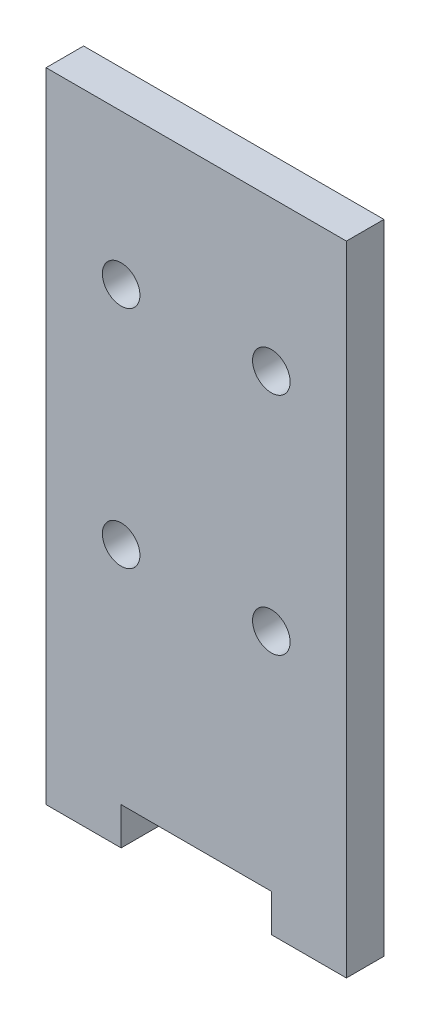
ISO-10303-21;
HEADER;
FILE_DESCRIPTION(('STEP AP214'),'2;1');
FILE_NAME('part.step','',(''),(''),'','','');
FILE_SCHEMA(('AUTOMOTIVE_DESIGN { 1 0 10303 214 1 1 1 1 }'));
ENDSEC;
DATA;
#1=APPLICATION_CONTEXT('core data for automotive mechanical design processes');
#2=APPLICATION_PROTOCOL_DEFINITION('international standard','automotive_design',2000,#1);
#3=PRODUCT_CONTEXT('',#1,'mechanical');
#4=PRODUCT('Part','Part','',(#3));
#5=PRODUCT_RELATED_PRODUCT_CATEGORY('part','',(#4));
#6=PRODUCT_DEFINITION_FORMATION('','',#4);
#7=PRODUCT_DEFINITION_CONTEXT('part definition',#1,'design');
#8=PRODUCT_DEFINITION('design','',#6,#7);
#9=PRODUCT_DEFINITION_SHAPE('','',#8);
#10=(LENGTH_UNIT() NAMED_UNIT(*) SI_UNIT(.MILLI.,.METRE.));
#11=(NAMED_UNIT(*) PLANE_ANGLE_UNIT() SI_UNIT($,.RADIAN.));
#12=(NAMED_UNIT(*) SI_UNIT($,.STERADIAN.) SOLID_ANGLE_UNIT());
#13=UNCERTAINTY_MEASURE_WITH_UNIT(LENGTH_MEASURE(1.E-05),#10,'distance_accuracy_value','');
#14=(GEOMETRIC_REPRESENTATION_CONTEXT(3) GLOBAL_UNCERTAINTY_ASSIGNED_CONTEXT((#13)) GLOBAL_UNIT_ASSIGNED_CONTEXT((#10,
#11,#12)) REPRESENTATION_CONTEXT('',''));
#15=CARTESIAN_POINT('',(0.,0.,0.));
#16=DIRECTION('',(0.,0.,1.));
#17=DIRECTION('',(1.,0.,0.));
#18=AXIS2_PLACEMENT_3D('',#15,#16,#17);
#19=CARTESIAN_POINT('',(0.,0.,6.35));
#20=DIRECTION('',(0.,0.,1.));
#21=DIRECTION('',(1.,0.,0.));
#22=AXIS2_PLACEMENT_3D('',#19,#20,#21);
#23=PLANE('',#22);
#24=CARTESIAN_POINT('',(12.7,38.1,6.35));
#25=DIRECTION('',(0.,0.,1.));
#26=DIRECTION('',(1.,0.,0.));
#27=AXIS2_PLACEMENT_3D('',#24,#25,#26);
#28=CIRCLE('',#27,3.175);
#29=CARTESIAN_POINT('',(15.875,38.1,6.35));
#30=VERTEX_POINT('',#29);
#31=EDGE_CURVE('E190',#30,#30,#28,.T.);
#32=ORIENTED_EDGE('',*,*,#31,.F.);
#33=EDGE_LOOP('',(#32));
#34=FACE_BOUND('',#33,.T.);
#35=CARTESIAN_POINT('',(12.7,76.2,6.35));
#36=DIRECTION('',(0.,0.,1.));
#37=DIRECTION('',(1.,0.,0.));
#38=AXIS2_PLACEMENT_3D('',#35,#36,#37);
#39=CIRCLE('',#38,3.175);
#40=CARTESIAN_POINT('',(15.875,76.2,6.35));
#41=VERTEX_POINT('',#40);
#42=EDGE_CURVE('E136',#41,#41,#39,.T.);
#43=ORIENTED_EDGE('',*,*,#42,.F.);
#44=EDGE_LOOP('',(#43));
#45=FACE_BOUND('',#44,.T.);
#46=DIRECTION('',(0.,-1.,0.));
#47=VECTOR('',#46,1.);
#48=CARTESIAN_POINT('',(0.,0.,6.35));
#49=LINE('',#48,#47);
#50=CARTESIAN_POINT('',(0.,101.6,6.35));
#51=VERTEX_POINT('',#50);
#52=CARTESIAN_POINT('',(0.,-6.35,6.35));
#53=VERTEX_POINT('',#52);
#54=EDGE_CURVE('E49',#51,#53,#49,.T.);
#55=ORIENTED_EDGE('',*,*,#54,.T.);
#56=DIRECTION('',(1.,0.,0.));
#57=VECTOR('',#56,1.);
#58=CARTESIAN_POINT('',(0.,-6.35,6.35));
#59=LINE('',#58,#57);
#60=CARTESIAN_POINT('',(12.7,-6.35,6.35));
#61=VERTEX_POINT('',#60);
#62=EDGE_CURVE('E92',#53,#61,#59,.T.);
#63=ORIENTED_EDGE('',*,*,#62,.T.);
#64=DIRECTION('',(0.,1.,0.));
#65=VECTOR('',#64,1.);
#66=CARTESIAN_POINT('',(12.7,0.,6.35));
#67=LINE('',#66,#65);
#68=CARTESIAN_POINT('',(12.7,0.,6.35));
#69=VERTEX_POINT('',#68);
#70=EDGE_CURVE('E161',#61,#69,#67,.T.);
#71=ORIENTED_EDGE('',*,*,#70,.T.);
#72=DIRECTION('',(1.,0.,0.));
#73=VECTOR('',#72,1.);
#74=CARTESIAN_POINT('',(12.7,0.,6.35));
#75=LINE('',#74,#73);
#76=CARTESIAN_POINT('',(38.1,0.,6.35));
#77=VERTEX_POINT('',#76);
#78=EDGE_CURVE('E175',#69,#77,#75,.T.);
#79=ORIENTED_EDGE('',*,*,#78,.T.);
#80=DIRECTION('',(0.,-1.,0.));
#81=VECTOR('',#80,1.);
#82=CARTESIAN_POINT('',(38.1,0.,6.35));
#83=LINE('',#82,#81);
#84=CARTESIAN_POINT('',(38.1,-6.35,6.35));
#85=VERTEX_POINT('',#84);
#86=EDGE_CURVE('E112',#77,#85,#83,.T.);
#87=ORIENTED_EDGE('',*,*,#86,.T.);
#88=DIRECTION('',(1.,0.,0.));
#89=VECTOR('',#88,1.);
#90=CARTESIAN_POINT('',(50.8,-6.34999999999999,6.35));
#91=LINE('',#90,#89);
#92=CARTESIAN_POINT('',(50.8,-6.34999999999999,6.35));
#93=VERTEX_POINT('',#92);
#94=EDGE_CURVE('E106',#85,#93,#91,.T.);
#95=ORIENTED_EDGE('',*,*,#94,.T.);
#96=DIRECTION('',(0.,1.,0.));
#97=VECTOR('',#96,1.);
#98=CARTESIAN_POINT('',(50.8,0.,6.35));
#99=LINE('',#98,#97);
#100=CARTESIAN_POINT('',(50.8,101.6,6.35));
#101=VERTEX_POINT('',#100);
#102=EDGE_CURVE('E110',#93,#101,#99,.T.);
#103=ORIENTED_EDGE('',*,*,#102,.T.);
#104=DIRECTION('',(-1.,0.,0.));
#105=VECTOR('',#104,1.);
#106=CARTESIAN_POINT('',(0.,101.6,6.35));
#107=LINE('',#106,#105);
#108=EDGE_CURVE('E127',#101,#51,#107,.T.);
#109=ORIENTED_EDGE('',*,*,#108,.T.);
#110=EDGE_LOOP('',(#55,#63,#71,#79,#87,#95,#103,#109));
#111=FACE_BOUND('',#110,.T.);
#112=CARTESIAN_POINT('',(38.1,76.2,6.35));
#113=DIRECTION('',(0.,0.,1.));
#114=DIRECTION('',(-1.,0.,0.));
#115=AXIS2_PLACEMENT_3D('',#112,#113,#114);
#116=CIRCLE('',#115,3.175);
#117=CARTESIAN_POINT('',(34.925,76.2,6.35));
#118=VERTEX_POINT('',#117);
#119=EDGE_CURVE('E184',#118,#118,#116,.T.);
#120=ORIENTED_EDGE('',*,*,#119,.F.);
#121=EDGE_LOOP('',(#120));
#122=FACE_BOUND('',#121,.T.);
#123=CARTESIAN_POINT('',(38.1,38.1,6.35));
#124=DIRECTION('',(0.,0.,1.));
#125=DIRECTION('',(-1.,0.,0.));
#126=AXIS2_PLACEMENT_3D('',#123,#124,#125);
#127=CIRCLE('',#126,3.17500000000001);
#128=CARTESIAN_POINT('',(34.925,38.1,6.35));
#129=VERTEX_POINT('',#128);
#130=EDGE_CURVE('E196',#129,#129,#127,.T.);
#131=ORIENTED_EDGE('',*,*,#130,.F.);
#132=EDGE_LOOP('',(#131));
#133=FACE_BOUND('',#132,.T.);
#134=ADVANCED_FACE('F32',(#34,#45,#111,#122,#133),#23,.T.);
#135=CARTESIAN_POINT('',(0.,0.,0.));
#136=DIRECTION('',(0.,0.,1.));
#137=DIRECTION('',(1.,0.,0.));
#138=AXIS2_PLACEMENT_3D('',#135,#136,#137);
#139=PLANE('',#138);
#140=DIRECTION('',(1.,0.,0.));
#141=VECTOR('',#140,1.);
#142=CARTESIAN_POINT('',(0.,-6.35,0.));
#143=LINE('',#142,#141);
#144=CARTESIAN_POINT('',(0.,-6.35,0.));
#145=VERTEX_POINT('',#144);
#146=CARTESIAN_POINT('',(12.7,-6.35,0.));
#147=VERTEX_POINT('',#146);
#148=EDGE_CURVE('E133',#145,#147,#143,.T.);
#149=ORIENTED_EDGE('',*,*,#148,.F.);
#150=DIRECTION('',(0.,-1.,0.));
#151=VECTOR('',#150,1.);
#152=CARTESIAN_POINT('',(0.,0.,0.));
#153=LINE('',#152,#151);
#154=CARTESIAN_POINT('',(0.,101.6,0.));
#155=VERTEX_POINT('',#154);
#156=EDGE_CURVE('E145',#155,#145,#153,.T.);
#157=ORIENTED_EDGE('',*,*,#156,.F.);
#158=DIRECTION('',(-1.,0.,0.));
#159=VECTOR('',#158,1.);
#160=CARTESIAN_POINT('',(0.,101.6,0.));
#161=LINE('',#160,#159);
#162=CARTESIAN_POINT('',(50.8,101.6,0.));
#163=VERTEX_POINT('',#162);
#164=EDGE_CURVE('E85',#163,#155,#161,.T.);
#165=ORIENTED_EDGE('',*,*,#164,.F.);
#166=DIRECTION('',(0.,1.,0.));
#167=VECTOR('',#166,1.);
#168=CARTESIAN_POINT('',(50.8,0.,0.));
#169=LINE('',#168,#167);
#170=CARTESIAN_POINT('',(50.8,-6.34999999999999,0.));
#171=VERTEX_POINT('',#170);
#172=EDGE_CURVE('E78',#171,#163,#169,.T.);
#173=ORIENTED_EDGE('',*,*,#172,.F.);
#174=DIRECTION('',(1.,0.,0.));
#175=VECTOR('',#174,1.);
#176=CARTESIAN_POINT('',(50.8,-6.34999999999999,0.));
#177=LINE('',#176,#175);
#178=CARTESIAN_POINT('',(38.1,-6.35,0.));
#179=VERTEX_POINT('',#178);
#180=EDGE_CURVE('E121',#179,#171,#177,.T.);
#181=ORIENTED_EDGE('',*,*,#180,.F.);
#182=DIRECTION('',(0.,-1.,0.));
#183=VECTOR('',#182,1.);
#184=CARTESIAN_POINT('',(38.1,0.,0.));
#185=LINE('',#184,#183);
#186=CARTESIAN_POINT('',(38.1,0.,0.));
#187=VERTEX_POINT('',#186);
#188=EDGE_CURVE('E140',#187,#179,#185,.T.);
#189=ORIENTED_EDGE('',*,*,#188,.F.);
#190=DIRECTION('',(1.,0.,0.));
#191=VECTOR('',#190,1.);
#192=CARTESIAN_POINT('',(12.7,0.,0.));
#193=LINE('',#192,#191);
#194=CARTESIAN_POINT('',(12.7,0.,0.));
#195=VERTEX_POINT('',#194);
#196=EDGE_CURVE('E138',#195,#187,#193,.T.);
#197=ORIENTED_EDGE('',*,*,#196,.F.);
#198=DIRECTION('',(0.,1.,0.));
#199=VECTOR('',#198,1.);
#200=CARTESIAN_POINT('',(12.7,0.,0.));
#201=LINE('',#200,#199);
#202=EDGE_CURVE('E135',#147,#195,#201,.T.);
#203=ORIENTED_EDGE('',*,*,#202,.F.);
#204=EDGE_LOOP('',(#149,#157,#165,#173,#181,#189,#197,#203));
#205=FACE_BOUND('',#204,.T.);
#206=CARTESIAN_POINT('',(12.7,76.2,0.));
#207=DIRECTION('',(0.,0.,1.));
#208=DIRECTION('',(1.,0.,0.));
#209=AXIS2_PLACEMENT_3D('',#206,#207,#208);
#210=CIRCLE('',#209,3.175);
#211=CARTESIAN_POINT('',(15.875,76.2,0.));
#212=VERTEX_POINT('',#211);
#213=EDGE_CURVE('E181',#212,#212,#210,.T.);
#214=ORIENTED_EDGE('',*,*,#213,.T.);
#215=EDGE_LOOP('',(#214));
#216=FACE_BOUND('',#215,.T.);
#217=CARTESIAN_POINT('',(38.1,76.2,0.));
#218=DIRECTION('',(0.,0.,1.));
#219=DIRECTION('',(-1.,0.,0.));
#220=AXIS2_PLACEMENT_3D('',#217,#218,#219);
#221=CIRCLE('',#220,3.175);
#222=CARTESIAN_POINT('',(34.925,76.2,0.));
#223=VERTEX_POINT('',#222);
#224=EDGE_CURVE('E187',#223,#223,#221,.T.);
#225=ORIENTED_EDGE('',*,*,#224,.T.);
#226=EDGE_LOOP('',(#225));
#227=FACE_BOUND('',#226,.T.);
#228=CARTESIAN_POINT('',(12.7,38.1,0.));
#229=DIRECTION('',(0.,0.,1.));
#230=DIRECTION('',(1.,0.,0.));
#231=AXIS2_PLACEMENT_3D('',#228,#229,#230);
#232=CIRCLE('',#231,3.175);
#233=CARTESIAN_POINT('',(15.875,38.1,0.));
#234=VERTEX_POINT('',#233);
#235=EDGE_CURVE('E193',#234,#234,#232,.T.);
#236=ORIENTED_EDGE('',*,*,#235,.T.);
#237=EDGE_LOOP('',(#236));
#238=FACE_BOUND('',#237,.T.);
#239=CARTESIAN_POINT('',(38.1,38.1,0.));
#240=DIRECTION('',(0.,0.,1.));
#241=DIRECTION('',(-1.,0.,0.));
#242=AXIS2_PLACEMENT_3D('',#239,#240,#241);
#243=CIRCLE('',#242,3.17500000000001);
#244=CARTESIAN_POINT('',(34.925,38.1,0.));
#245=VERTEX_POINT('',#244);
#246=EDGE_CURVE('E199',#245,#245,#243,.T.);
#247=ORIENTED_EDGE('',*,*,#246,.T.);
#248=EDGE_LOOP('',(#247));
#249=FACE_BOUND('',#248,.T.);
#250=ADVANCED_FACE('F165',(#205,#216,#227,#238,#249),#139,.F.);
#251=CARTESIAN_POINT('',(0.,-6.35,6.35));
#252=DIRECTION('',(0.,1.,0.));
#253=DIRECTION('',(0.,0.,1.));
#254=AXIS2_PLACEMENT_3D('',#251,#252,#253);
#255=PLANE('',#254);
#256=ORIENTED_EDGE('',*,*,#148,.T.);
#257=DIRECTION('',(0.,0.,-1.));
#258=VECTOR('',#257,1.);
#259=CARTESIAN_POINT('',(12.7,-6.35,6.35));
#260=LINE('',#259,#258);
#261=EDGE_CURVE('E41',#61,#147,#260,.T.);
#262=ORIENTED_EDGE('',*,*,#261,.F.);
#263=ORIENTED_EDGE('',*,*,#62,.F.);
#264=DIRECTION('',(0.,0.,-1.));
#265=VECTOR('',#264,1.);
#266=CARTESIAN_POINT('',(0.,-6.35,6.35));
#267=LINE('',#266,#265);
#268=EDGE_CURVE('E11',#53,#145,#267,.T.);
#269=ORIENTED_EDGE('',*,*,#268,.T.);
#270=EDGE_LOOP('',(#256,#262,#263,#269));
#271=FACE_BOUND('',#270,.T.);
#272=ADVANCED_FACE('F34',(#271),#255,.F.);
#273=CARTESIAN_POINT('',(12.7,0.,6.35));
#274=DIRECTION('',(-1.,0.,0.));
#275=DIRECTION('',(0.,0.,1.));
#276=AXIS2_PLACEMENT_3D('',#273,#274,#275);
#277=PLANE('',#276);
#278=ORIENTED_EDGE('',*,*,#202,.T.);
#279=DIRECTION('',(0.,0.,-1.));
#280=VECTOR('',#279,1.);
#281=CARTESIAN_POINT('',(12.7,0.,6.35));
#282=LINE('',#281,#280);
#283=EDGE_CURVE('E153',#69,#195,#282,.T.);
#284=ORIENTED_EDGE('',*,*,#283,.F.);
#285=ORIENTED_EDGE('',*,*,#70,.F.);
#286=ORIENTED_EDGE('',*,*,#261,.T.);
#287=EDGE_LOOP('',(#278,#284,#285,#286));
#288=FACE_BOUND('',#287,.T.);
#289=ADVANCED_FACE('F159',(#288),#277,.F.);
#290=CARTESIAN_POINT('',(12.7,0.,6.35));
#291=DIRECTION('',(0.,1.,0.));
#292=DIRECTION('',(-1.,0.,0.));
#293=AXIS2_PLACEMENT_3D('',#290,#291,#292);
#294=PLANE('',#293);
#295=ORIENTED_EDGE('',*,*,#196,.T.);
#296=DIRECTION('',(0.,0.,-1.));
#297=VECTOR('',#296,1.);
#298=CARTESIAN_POINT('',(38.1,0.,6.35));
#299=LINE('',#298,#297);
#300=EDGE_CURVE('E150',#77,#187,#299,.T.);
#301=ORIENTED_EDGE('',*,*,#300,.F.);
#302=ORIENTED_EDGE('',*,*,#78,.F.);
#303=ORIENTED_EDGE('',*,*,#283,.T.);
#304=EDGE_LOOP('',(#295,#301,#302,#303));
#305=FACE_BOUND('',#304,.T.);
#306=ADVANCED_FACE('F171',(#305),#294,.F.);
#307=CARTESIAN_POINT('',(38.1,0.,6.35));
#308=DIRECTION('',(1.,0.,0.));
#309=DIRECTION('',(0.,1.,0.));
#310=AXIS2_PLACEMENT_3D('',#307,#308,#309);
#311=PLANE('',#310);
#312=ORIENTED_EDGE('',*,*,#188,.T.);
#313=DIRECTION('',(0.,0.,-1.));
#314=VECTOR('',#313,1.);
#315=CARTESIAN_POINT('',(38.1,-6.35,6.35));
#316=LINE('',#315,#314);
#317=EDGE_CURVE('E122',#85,#179,#316,.T.);
#318=ORIENTED_EDGE('',*,*,#317,.F.);
#319=ORIENTED_EDGE('',*,*,#86,.F.);
#320=ORIENTED_EDGE('',*,*,#300,.T.);
#321=EDGE_LOOP('',(#312,#318,#319,#320));
#322=FACE_BOUND('',#321,.T.);
#323=ADVANCED_FACE('F174',(#322),#311,.F.);
#324=CARTESIAN_POINT('',(50.8,-6.34999999999999,6.35));
#325=DIRECTION('',(0.,1.,0.));
#326=DIRECTION('',(-1.,0.,0.));
#327=AXIS2_PLACEMENT_3D('',#324,#325,#326);
#328=PLANE('',#327);
#329=ORIENTED_EDGE('',*,*,#180,.T.);
#330=DIRECTION('',(0.,0.,-1.));
#331=VECTOR('',#330,1.);
#332=CARTESIAN_POINT('',(50.8,-6.34999999999999,6.35));
#333=LINE('',#332,#331);
#334=EDGE_CURVE('E118',#93,#171,#333,.T.);
#335=ORIENTED_EDGE('',*,*,#334,.F.);
#336=ORIENTED_EDGE('',*,*,#94,.F.);
#337=ORIENTED_EDGE('',*,*,#317,.T.);
#338=EDGE_LOOP('',(#329,#335,#336,#337));
#339=FACE_BOUND('',#338,.T.);
#340=ADVANCED_FACE('F119',(#339),#328,.F.);
#341=CARTESIAN_POINT('',(50.8,0.,6.35));
#342=DIRECTION('',(-1.,0.,0.));
#343=DIRECTION('',(0.,0.,1.));
#344=AXIS2_PLACEMENT_3D('',#341,#342,#343);
#345=PLANE('',#344);
#346=ORIENTED_EDGE('',*,*,#172,.T.);
#347=DIRECTION('',(0.,0.,-1.));
#348=VECTOR('',#347,1.);
#349=CARTESIAN_POINT('',(50.8,101.6,6.35));
#350=LINE('',#349,#348);
#351=EDGE_CURVE('E123',#101,#163,#350,.T.);
#352=ORIENTED_EDGE('',*,*,#351,.F.);
#353=ORIENTED_EDGE('',*,*,#102,.F.);
#354=ORIENTED_EDGE('',*,*,#334,.T.);
#355=EDGE_LOOP('',(#346,#352,#353,#354));
#356=FACE_BOUND('',#355,.T.);
#357=ADVANCED_FACE('F125',(#356),#345,.F.);
#358=CARTESIAN_POINT('',(0.,101.6,6.35));
#359=DIRECTION('',(0.,-1.,0.));
#360=DIRECTION('',(0.,0.,-1.));
#361=AXIS2_PLACEMENT_3D('',#358,#359,#360);
#362=PLANE('',#361);
#363=ORIENTED_EDGE('',*,*,#164,.T.);
#364=DIRECTION('',(0.,0.,-1.));
#365=VECTOR('',#364,1.);
#366=CARTESIAN_POINT('',(0.,101.6,6.35));
#367=LINE('',#366,#365);
#368=EDGE_CURVE('E129',#51,#155,#367,.T.);
#369=ORIENTED_EDGE('',*,*,#368,.F.);
#370=ORIENTED_EDGE('',*,*,#108,.F.);
#371=ORIENTED_EDGE('',*,*,#351,.T.);
#372=EDGE_LOOP('',(#363,#369,#370,#371));
#373=FACE_BOUND('',#372,.T.);
#374=ADVANCED_FACE('F224',(#373),#362,.F.);
#375=CARTESIAN_POINT('',(0.,0.,6.35));
#376=DIRECTION('',(1.,0.,0.));
#377=DIRECTION('',(0.,0.,-1.));
#378=AXIS2_PLACEMENT_3D('',#375,#376,#377);
#379=PLANE('',#378);
#380=ORIENTED_EDGE('',*,*,#156,.T.);
#381=ORIENTED_EDGE('',*,*,#268,.F.);
#382=ORIENTED_EDGE('',*,*,#54,.F.);
#383=ORIENTED_EDGE('',*,*,#368,.T.);
#384=EDGE_LOOP('',(#380,#381,#382,#383));
#385=FACE_BOUND('',#384,.T.);
#386=ADVANCED_FACE('F221',(#385),#379,.F.);
#387=CARTESIAN_POINT('',(12.7,76.2,6.35));
#388=DIRECTION('',(0.,0.,-1.));
#389=DIRECTION('',(-1.,0.,0.));
#390=AXIS2_PLACEMENT_3D('',#387,#388,#389);
#391=CYLINDRICAL_SURFACE('',#390,3.175);
#392=ORIENTED_EDGE('',*,*,#42,.T.);
#393=EDGE_LOOP('',(#392));
#394=FACE_BOUND('',#393,.T.);
#395=ORIENTED_EDGE('',*,*,#213,.F.);
#396=EDGE_LOOP('',(#395));
#397=FACE_BOUND('',#396,.T.);
#398=ADVANCED_FACE('F218',(#394,#397),#391,.F.);
#399=CARTESIAN_POINT('',(38.1,76.2,6.35));
#400=DIRECTION('',(0.,0.,-1.));
#401=DIRECTION('',(-1.,0.,0.));
#402=AXIS2_PLACEMENT_3D('',#399,#400,#401);
#403=CYLINDRICAL_SURFACE('',#402,3.175);
#404=ORIENTED_EDGE('',*,*,#119,.T.);
#405=EDGE_LOOP('',(#404));
#406=FACE_BOUND('',#405,.T.);
#407=ORIENTED_EDGE('',*,*,#224,.F.);
#408=EDGE_LOOP('',(#407));
#409=FACE_BOUND('',#408,.T.);
#410=ADVANCED_FACE('F300',(#406,#409),#403,.F.);
#411=CARTESIAN_POINT('',(12.7,38.1,6.35));
#412=DIRECTION('',(0.,0.,-1.));
#413=DIRECTION('',(-1.,0.,0.));
#414=AXIS2_PLACEMENT_3D('',#411,#412,#413);
#415=CYLINDRICAL_SURFACE('',#414,3.175);
#416=ORIENTED_EDGE('',*,*,#31,.T.);
#417=EDGE_LOOP('',(#416));
#418=FACE_BOUND('',#417,.T.);
#419=ORIENTED_EDGE('',*,*,#235,.F.);
#420=EDGE_LOOP('',(#419));
#421=FACE_BOUND('',#420,.T.);
#422=ADVANCED_FACE('F308',(#418,#421),#415,.F.);
#423=CARTESIAN_POINT('',(38.1,38.1,6.35));
#424=DIRECTION('',(0.,0.,-1.));
#425=DIRECTION('',(-1.,0.,0.));
#426=AXIS2_PLACEMENT_3D('',#423,#424,#425);
#427=CYLINDRICAL_SURFACE('',#426,3.17500000000001);
#428=ORIENTED_EDGE('',*,*,#130,.T.);
#429=EDGE_LOOP('',(#428));
#430=FACE_BOUND('',#429,.T.);
#431=ORIENTED_EDGE('',*,*,#246,.F.);
#432=EDGE_LOOP('',(#431));
#433=FACE_BOUND('',#432,.T.);
#434=ADVANCED_FACE('F205',(#430,#433),#427,.F.);
#435=CLOSED_SHELL('',(#134,#250,#272,#289,#306,#323,#340,#357,#374,#386,#398,#410,#422,#434));
#436=MANIFOLD_SOLID_BREP('B2',#435);
#437=ADVANCED_BREP_SHAPE_REPRESENTATION('',(#18,#436),#14);
#438=SHAPE_DEFINITION_REPRESENTATION(#9,#437);
ENDSEC;
END-ISO-10303-21;
